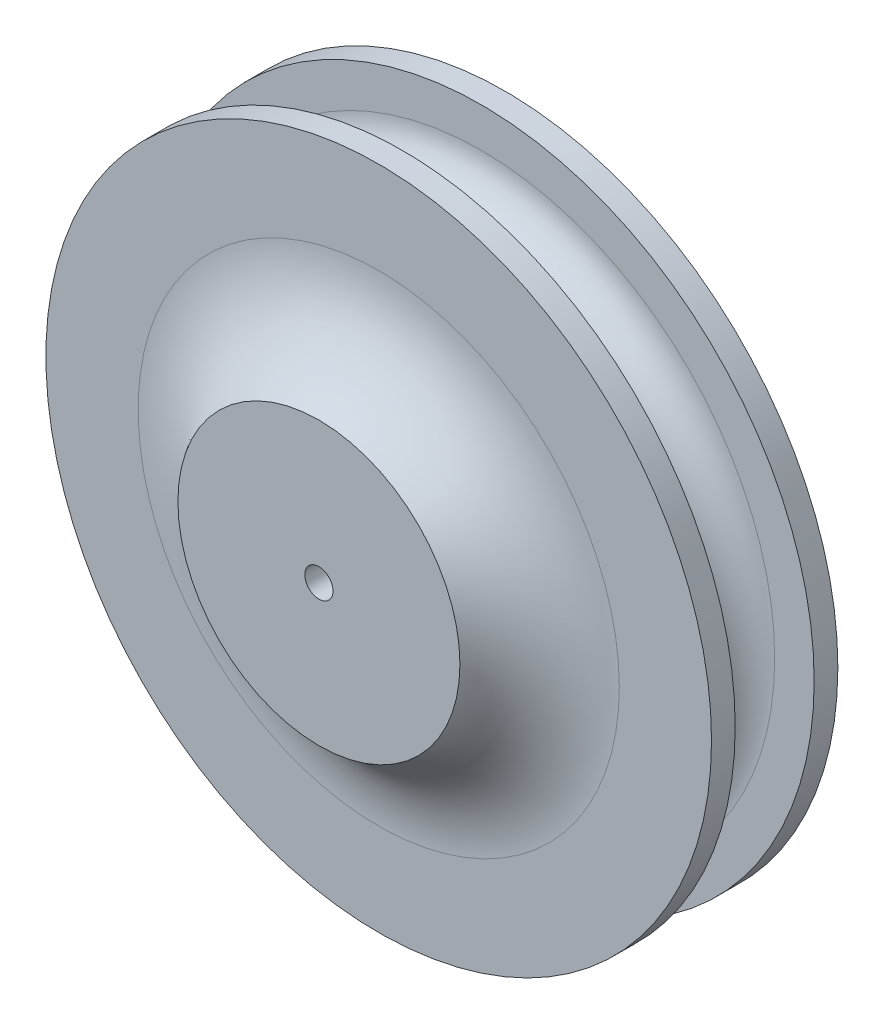
ISO-10303-21;
HEADER;
FILE_DESCRIPTION(('STEP AP214'),'2;1');
FILE_NAME('part.step','',(''),(''),'','','');
FILE_SCHEMA(('AUTOMOTIVE_DESIGN { 1 0 10303 214 1 1 1 1 }'));
ENDSEC;
DATA;
#1=APPLICATION_CONTEXT('core data for automotive mechanical design processes');
#2=APPLICATION_PROTOCOL_DEFINITION('international standard','automotive_design',2000,#1);
#3=PRODUCT_CONTEXT('',#1,'mechanical');
#4=PRODUCT('Part','Part','',(#3));
#5=PRODUCT_RELATED_PRODUCT_CATEGORY('part','',(#4));
#6=PRODUCT_DEFINITION_FORMATION('','',#4);
#7=PRODUCT_DEFINITION_CONTEXT('part definition',#1,'design');
#8=PRODUCT_DEFINITION('design','',#6,#7);
#9=PRODUCT_DEFINITION_SHAPE('','',#8);
#10=(LENGTH_UNIT() NAMED_UNIT(*) SI_UNIT(.MILLI.,.METRE.));
#11=(NAMED_UNIT(*) PLANE_ANGLE_UNIT() SI_UNIT($,.RADIAN.));
#12=(NAMED_UNIT(*) SI_UNIT($,.STERADIAN.) SOLID_ANGLE_UNIT());
#13=UNCERTAINTY_MEASURE_WITH_UNIT(LENGTH_MEASURE(1.E-05),#10,'distance_accuracy_value','');
#14=(GEOMETRIC_REPRESENTATION_CONTEXT(3) GLOBAL_UNCERTAINTY_ASSIGNED_CONTEXT((#13)) GLOBAL_UNIT_ASSIGNED_CONTEXT((#10,
#11,#12)) REPRESENTATION_CONTEXT('',''));
#15=CARTESIAN_POINT('',(0.,0.,0.));
#16=DIRECTION('',(0.,0.,1.));
#17=DIRECTION('',(1.,0.,0.));
#18=AXIS2_PLACEMENT_3D('',#15,#16,#17);
#19=CARTESIAN_POINT('',(0.,0.,-3.556));
#20=DIRECTION('',(0.,0.,1.));
#21=DIRECTION('',(1.,0.,0.));
#22=AXIS2_PLACEMENT_3D('',#19,#20,#21);
#23=CYLINDRICAL_SURFACE('',#22,18.7325);
#24=CARTESIAN_POINT('',(0.,0.,-3.556));
#25=DIRECTION('',(0.,0.,1.));
#26=DIRECTION('',(1.,0.,0.));
#27=AXIS2_PLACEMENT_3D('',#24,#25,#26);
#28=CIRCLE('',#27,18.7325);
#29=CARTESIAN_POINT('',(18.7325,0.,-3.556));
#30=VERTEX_POINT('',#29);
#31=EDGE_CURVE('E48',#30,#30,#28,.T.);
#32=ORIENTED_EDGE('',*,*,#31,.T.);
#33=EDGE_LOOP('',(#32));
#34=FACE_BOUND('',#33,.T.);
#35=CARTESIAN_POINT('',(0.,0.,-2.2225));
#36=DIRECTION('',(0.,0.,1.));
#37=DIRECTION('',(1.,0.,0.));
#38=AXIS2_PLACEMENT_3D('',#35,#36,#37);
#39=CIRCLE('',#38,18.7325);
#40=CARTESIAN_POINT('',(18.7325,0.,-2.2225));
#41=VERTEX_POINT('',#40);
#42=EDGE_CURVE('E55',#41,#41,#39,.F.);
#43=ORIENTED_EDGE('',*,*,#42,.T.);
#44=EDGE_LOOP('',(#43));
#45=FACE_BOUND('',#44,.T.);
#46=ADVANCED_FACE('F37',(#34,#45),#23,.T.);
#47=CARTESIAN_POINT('',(0.,0.,-3.556));
#48=DIRECTION('',(0.,0.,1.));
#49=DIRECTION('',(1.,0.,0.));
#50=AXIS2_PLACEMENT_3D('',#47,#48,#49);
#51=PLANE('',#50);
#52=CARTESIAN_POINT('',(0.,0.,-3.556));
#53=DIRECTION('',(0.,0.,1.));
#54=DIRECTION('',(1.,0.,0.));
#55=AXIS2_PLACEMENT_3D('',#52,#53,#54);
#56=CIRCLE('',#55,13.5424317346423);
#57=CARTESIAN_POINT('',(13.5424317346423,0.,-3.556));
#58=VERTEX_POINT('',#57);
#59=EDGE_CURVE('E10',#58,#58,#56,.T.);
#60=ORIENTED_EDGE('',*,*,#59,.T.);
#61=EDGE_LOOP('',(#60));
#62=FACE_BOUND('',#61,.T.);
#63=ORIENTED_EDGE('',*,*,#31,.F.);
#64=EDGE_LOOP('',(#63));
#65=FACE_BOUND('',#64,.T.);
#66=ADVANCED_FACE('F97',(#62,#65),#51,.F.);
#67=CARTESIAN_POINT('',(0.,0.,0.));
#68=DIRECTION('',(0.,0.,1.));
#69=DIRECTION('',(1.,0.,0.));
#70=AXIS2_PLACEMENT_3D('',#67,#68,#69);
#71=TOROIDAL_SURFACE('',#70,16.51,2.2225);
#72=CARTESIAN_POINT('',(0.,0.,-2.2225));
#73=DIRECTION('',(0.,0.,1.));
#74=DIRECTION('',(1.,0.,0.));
#75=AXIS2_PLACEMENT_3D('',#72,#73,#74);
#76=CIRCLE('',#75,16.51);
#77=CARTESIAN_POINT('',(16.51,0.,-2.2225));
#78=VERTEX_POINT('',#77);
#79=EDGE_CURVE('E60',#78,#78,#76,.T.);
#80=ORIENTED_EDGE('',*,*,#79,.T.);
#81=EDGE_LOOP('',(#80));
#82=FACE_BOUND('',#81,.T.);
#83=CARTESIAN_POINT('',(0.,0.,2.2225));
#84=DIRECTION('',(0.,0.,1.));
#85=DIRECTION('',(1.,0.,0.));
#86=AXIS2_PLACEMENT_3D('',#83,#84,#85);
#87=CIRCLE('',#86,16.51);
#88=CARTESIAN_POINT('',(16.51,0.,2.2225));
#89=VERTEX_POINT('',#88);
#90=EDGE_CURVE('E66',#89,#89,#87,.T.);
#91=ORIENTED_EDGE('',*,*,#90,.F.);
#92=EDGE_LOOP('',(#91));
#93=FACE_BOUND('',#92,.T.);
#94=ADVANCED_FACE('F105',(#82,#93),#71,.F.);
#95=CARTESIAN_POINT('',(0.,16.51,-2.2225));
#96=DIRECTION('',(0.,0.,1.));
#97=DIRECTION('',(1.,0.,0.));
#98=AXIS2_PLACEMENT_3D('',#95,#96,#97);
#99=PLANE('',#98);
#100=ORIENTED_EDGE('',*,*,#42,.F.);
#101=EDGE_LOOP('',(#100));
#102=FACE_BOUND('',#101,.T.);
#103=ORIENTED_EDGE('',*,*,#79,.F.);
#104=EDGE_LOOP('',(#103));
#105=FACE_BOUND('',#104,.T.);
#106=ADVANCED_FACE('F125',(#102,#105),#99,.T.);
#107=CARTESIAN_POINT('',(0.,16.51,2.2225));
#108=DIRECTION('',(0.,0.,-1.));
#109=DIRECTION('',(-1.,0.,0.));
#110=AXIS2_PLACEMENT_3D('',#107,#108,#109);
#111=PLANE('',#110);
#112=CARTESIAN_POINT('',(0.,0.,2.2225));
#113=DIRECTION('',(0.,0.,-1.));
#114=DIRECTION('',(-1.,0.,0.));
#115=AXIS2_PLACEMENT_3D('',#112,#113,#114);
#116=CIRCLE('',#115,18.7325);
#117=CARTESIAN_POINT('',(-18.7325,0.,2.2225));
#118=VERTEX_POINT('',#117);
#119=EDGE_CURVE('E58',#118,#118,#116,.F.);
#120=ORIENTED_EDGE('',*,*,#119,.F.);
#121=EDGE_LOOP('',(#120));
#122=FACE_BOUND('',#121,.T.);
#123=ORIENTED_EDGE('',*,*,#90,.T.);
#124=EDGE_LOOP('',(#123));
#125=FACE_BOUND('',#124,.T.);
#126=ADVANCED_FACE('F118',(#122,#125),#111,.T.);
#127=CARTESIAN_POINT('',(0.,0.,3.556));
#128=DIRECTION('',(0.,0.,1.));
#129=DIRECTION('',(1.,0.,0.));
#130=AXIS2_PLACEMENT_3D('',#127,#128,#129);
#131=PLANE('',#130);
#132=CARTESIAN_POINT('',(0.,0.,3.556));
#133=DIRECTION('',(0.,0.,1.));
#134=DIRECTION('',(1.,0.,0.));
#135=AXIS2_PLACEMENT_3D('',#132,#133,#134);
#136=CIRCLE('',#135,13.5424317346423);
#137=CARTESIAN_POINT('',(13.5424317346423,0.,3.556));
#138=VERTEX_POINT('',#137);
#139=EDGE_CURVE('E44',#138,#138,#136,.F.);
#140=ORIENTED_EDGE('',*,*,#139,.T.);
#141=EDGE_LOOP('',(#140));
#142=FACE_BOUND('',#141,.T.);
#143=CARTESIAN_POINT('',(0.,0.,3.556));
#144=DIRECTION('',(0.,0.,1.));
#145=DIRECTION('',(1.,0.,0.));
#146=AXIS2_PLACEMENT_3D('',#143,#144,#145);
#147=CIRCLE('',#146,18.7325);
#148=CARTESIAN_POINT('',(18.7325,0.,3.556));
#149=VERTEX_POINT('',#148);
#150=EDGE_CURVE('E52',#149,#149,#147,.T.);
#151=ORIENTED_EDGE('',*,*,#150,.T.);
#152=EDGE_LOOP('',(#151));
#153=FACE_BOUND('',#152,.T.);
#154=ADVANCED_FACE('F110',(#142,#153),#131,.T.);
#155=ORIENTED_EDGE('',*,*,#150,.F.);
#156=EDGE_LOOP('',(#155));
#157=FACE_BOUND('',#156,.T.);
#158=ORIENTED_EDGE('',*,*,#119,.T.);
#159=EDGE_LOOP('',(#158));
#160=FACE_BOUND('',#159,.T.);
#161=ADVANCED_FACE('F100',(#157,#160),#23,.T.);
#162=CARTESIAN_POINT('',(0.,0.,6.9215));
#163=DIRECTION('',(0.,0.,1.));
#164=DIRECTION('',(1.,0.,0.));
#165=AXIS2_PLACEMENT_3D('',#162,#163,#164);
#166=PLANE('',#165);
#167=CARTESIAN_POINT('',(0.,0.,6.9215));
#168=DIRECTION('',(0.,0.,1.));
#169=DIRECTION('',(1.,0.,0.));
#170=AXIS2_PLACEMENT_3D('',#167,#168,#169);
#171=CIRCLE('',#170,0.79375);
#172=CARTESIAN_POINT('',(0.79375,0.,6.9215));
#173=VERTEX_POINT('',#172);
#174=EDGE_CURVE('E75',#173,#173,#171,.T.);
#175=ORIENTED_EDGE('',*,*,#174,.F.);
#176=EDGE_LOOP('',(#175));
#177=FACE_BOUND('',#176,.T.);
#178=CARTESIAN_POINT('',(0.,0.,6.9215));
#179=DIRECTION('',(0.,0.,1.));
#180=DIRECTION('',(1.,0.,0.));
#181=AXIS2_PLACEMENT_3D('',#178,#179,#180);
#182=CIRCLE('',#181,7.9375);
#183=CARTESIAN_POINT('',(7.9375,0.,6.9215));
#184=VERTEX_POINT('',#183);
#185=EDGE_CURVE('E72',#184,#184,#182,.T.);
#186=ORIENTED_EDGE('',*,*,#185,.T.);
#187=EDGE_LOOP('',(#186));
#188=FACE_BOUND('',#187,.T.);
#189=ADVANCED_FACE('F109',(#177,#188),#166,.T.);
#190=CARTESIAN_POINT('',(0.,0.,-6.9215));
#191=DIRECTION('',(0.,0.,1.));
#192=DIRECTION('',(1.,0.,0.));
#193=AXIS2_PLACEMENT_3D('',#190,#191,#192);
#194=PLANE('',#193);
#195=CARTESIAN_POINT('',(0.,0.,-6.9215));
#196=DIRECTION('',(0.,0.,1.));
#197=DIRECTION('',(1.,0.,0.));
#198=AXIS2_PLACEMENT_3D('',#195,#196,#197);
#199=CIRCLE('',#198,0.79375);
#200=CARTESIAN_POINT('',(0.79375,0.,-6.9215));
#201=VERTEX_POINT('',#200);
#202=EDGE_CURVE('E78',#201,#201,#199,.T.);
#203=ORIENTED_EDGE('',*,*,#202,.T.);
#204=EDGE_LOOP('',(#203));
#205=FACE_BOUND('',#204,.T.);
#206=CARTESIAN_POINT('',(0.,0.,-6.9215));
#207=DIRECTION('',(0.,0.,1.));
#208=DIRECTION('',(1.,0.,0.));
#209=AXIS2_PLACEMENT_3D('',#206,#207,#208);
#210=CIRCLE('',#209,7.9375);
#211=CARTESIAN_POINT('',(7.9375,0.,-6.9215));
#212=VERTEX_POINT('',#211);
#213=EDGE_CURVE('E69',#212,#212,#210,.T.);
#214=ORIENTED_EDGE('',*,*,#213,.F.);
#215=EDGE_LOOP('',(#214));
#216=FACE_BOUND('',#215,.T.);
#217=ADVANCED_FACE('F82',(#205,#216),#194,.F.);
#218=CARTESIAN_POINT('',(0.,0.,9.906));
#219=DIRECTION('',(0.,0.,1.));
#220=DIRECTION('',(1.,0.,0.));
#221=AXIS2_PLACEMENT_3D('',#218,#219,#220);
#222=TOROIDAL_SURFACE('',#221,13.5424317346423,6.35);
#223=ORIENTED_EDGE('',*,*,#139,.F.);
#224=EDGE_LOOP('',(#223));
#225=FACE_BOUND('',#224,.T.);
#226=ORIENTED_EDGE('',*,*,#185,.F.);
#227=EDGE_LOOP('',(#226));
#228=FACE_BOUND('',#227,.T.);
#229=ADVANCED_FACE('F93',(#225,#228),#222,.F.);
#230=CARTESIAN_POINT('',(0.,0.,-9.906));
#231=DIRECTION('',(0.,0.,1.));
#232=DIRECTION('',(1.,0.,0.));
#233=AXIS2_PLACEMENT_3D('',#230,#231,#232);
#234=TOROIDAL_SURFACE('',#233,13.5424317346423,6.35);
#235=ORIENTED_EDGE('',*,*,#213,.T.);
#236=EDGE_LOOP('',(#235));
#237=FACE_BOUND('',#236,.T.);
#238=ORIENTED_EDGE('',*,*,#59,.F.);
#239=EDGE_LOOP('',(#238));
#240=FACE_BOUND('',#239,.T.);
#241=ADVANCED_FACE('F39',(#237,#240),#234,.F.);
#242=CARTESIAN_POINT('',(0.,0.,-6.9215));
#243=DIRECTION('',(0.,0.,1.));
#244=DIRECTION('',(1.,0.,0.));
#245=AXIS2_PLACEMENT_3D('',#242,#243,#244);
#246=CYLINDRICAL_SURFACE('',#245,0.79375);
#247=ORIENTED_EDGE('',*,*,#174,.T.);
#248=EDGE_LOOP('',(#247));
#249=FACE_BOUND('',#248,.T.);
#250=ORIENTED_EDGE('',*,*,#202,.F.);
#251=EDGE_LOOP('',(#250));
#252=FACE_BOUND('',#251,.T.);
#253=ADVANCED_FACE('F85',(#249,#252),#246,.F.);
#254=CLOSED_SHELL('',(#46,#66,#94,#106,#126,#154,#161,#189,#217,#229,#241,#253));
#255=MANIFOLD_SOLID_BREP('B2',#254);
#256=ADVANCED_BREP_SHAPE_REPRESENTATION('',(#18,#255),#14);
#257=SHAPE_DEFINITION_REPRESENTATION(#9,#256);
ENDSEC;
END-ISO-10303-21;
